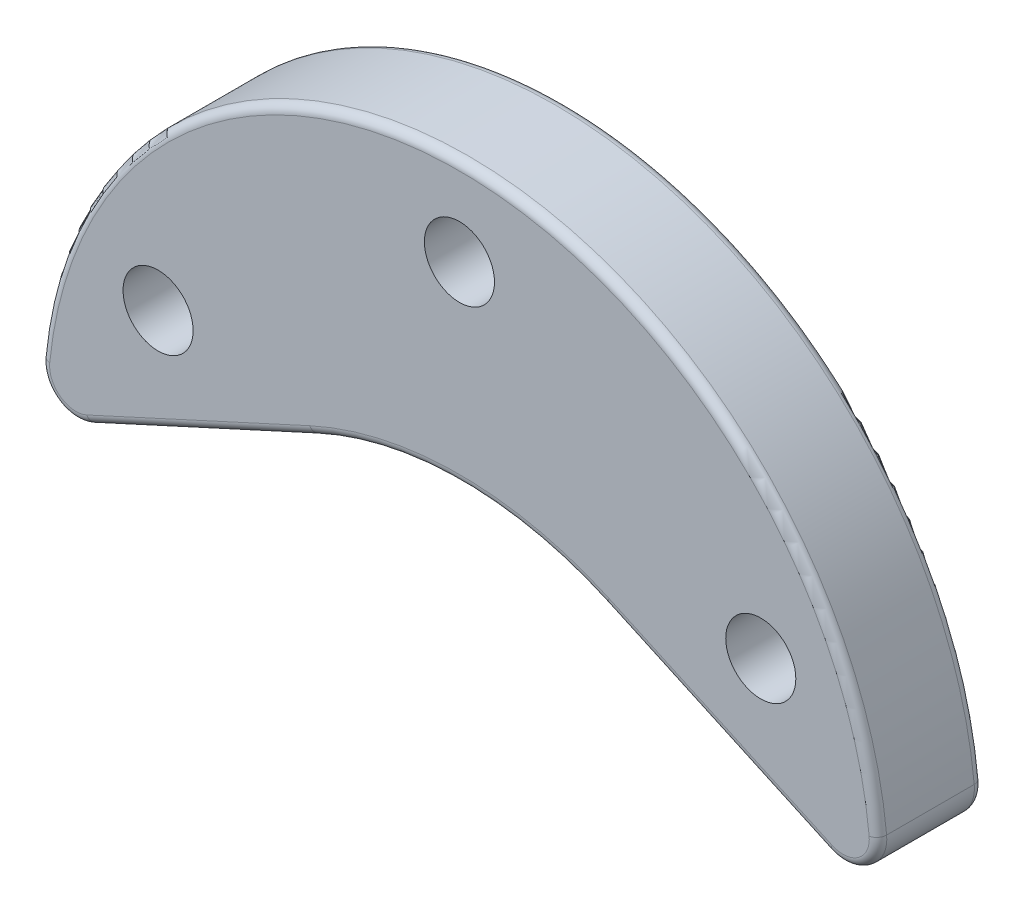
ISO-10303-21;
HEADER;
FILE_DESCRIPTION(('STEP AP214'),'2;1');
FILE_NAME('part.step','',(''),(''),'','','');
FILE_SCHEMA(('AUTOMOTIVE_DESIGN { 1 0 10303 214 1 1 1 1 }'));
ENDSEC;
DATA;
#1=APPLICATION_CONTEXT('core data for automotive mechanical design processes');
#2=APPLICATION_PROTOCOL_DEFINITION('international standard','automotive_design',2000,#1);
#3=PRODUCT_CONTEXT('',#1,'mechanical');
#4=PRODUCT('Part','Part','',(#3));
#5=PRODUCT_RELATED_PRODUCT_CATEGORY('part','',(#4));
#6=PRODUCT_DEFINITION_FORMATION('','',#4);
#7=PRODUCT_DEFINITION_CONTEXT('part definition',#1,'design');
#8=PRODUCT_DEFINITION('design','',#6,#7);
#9=PRODUCT_DEFINITION_SHAPE('','',#8);
#10=(LENGTH_UNIT() NAMED_UNIT(*) SI_UNIT(.MILLI.,.METRE.));
#11=(NAMED_UNIT(*) PLANE_ANGLE_UNIT() SI_UNIT($,.RADIAN.));
#12=(NAMED_UNIT(*) SI_UNIT($,.STERADIAN.) SOLID_ANGLE_UNIT());
#13=UNCERTAINTY_MEASURE_WITH_UNIT(LENGTH_MEASURE(1.E-05),#10,'distance_accuracy_value','');
#14=(GEOMETRIC_REPRESENTATION_CONTEXT(3) GLOBAL_UNCERTAINTY_ASSIGNED_CONTEXT((#13)) GLOBAL_UNIT_ASSIGNED_CONTEXT((#10,
#11,#12)) REPRESENTATION_CONTEXT('',''));
#15=CARTESIAN_POINT('',(0.,0.,0.));
#16=DIRECTION('',(0.,0.,1.));
#17=DIRECTION('',(1.,0.,0.));
#18=AXIS2_PLACEMENT_3D('',#15,#16,#17);
#19=CARTESIAN_POINT('',(0.,0.,-3.));
#20=DIRECTION('',(0.,0.,-1.));
#21=DIRECTION('',(-1.,0.,0.));
#22=AXIS2_PLACEMENT_3D('',#19,#20,#21);
#23=CYLINDRICAL_SURFACE('',#22,12.);
#24=DIRECTION('',(0.,0.,-1.));
#25=VECTOR('',#24,1.);
#26=CARTESIAN_POINT('',(11.9416242428372,1.18220575319335,-3.));
#27=LINE('',#26,#25);
#28=CARTESIAN_POINT('',(11.9416242428372,1.18220575319335,-3.25));
#29=VERTEX_POINT('',#28);
#30=CARTESIAN_POINT('',(11.9416242428372,1.18220575319335,-5.75));
#31=VERTEX_POINT('',#30);
#32=EDGE_CURVE('E245',#29,#31,#27,.T.);
#33=ORIENTED_EDGE('',*,*,#32,.T.);
#34=CARTESIAN_POINT('',(0.,0.,-5.75));
#35=DIRECTION('',(0.,0.,1.));
#36=DIRECTION('',(1.,0.,0.));
#37=AXIS2_PLACEMENT_3D('',#34,#35,#36);
#38=CIRCLE('',#37,12.);
#39=CARTESIAN_POINT('',(-11.9416242428372,1.18220575319335,-5.75));
#40=VERTEX_POINT('',#39);
#41=EDGE_CURVE('E11',#31,#40,#38,.T.);
#42=ORIENTED_EDGE('',*,*,#41,.T.);
#43=DIRECTION('',(0.,0.,-1.));
#44=VECTOR('',#43,1.);
#45=CARTESIAN_POINT('',(-11.9416242428372,1.18220575319335,-3.));
#46=LINE('',#45,#44);
#47=CARTESIAN_POINT('',(-11.9416242428372,1.18220575319335,-3.25));
#48=VERTEX_POINT('',#47);
#49=EDGE_CURVE('E248',#40,#48,#46,.F.);
#50=ORIENTED_EDGE('',*,*,#49,.T.);
#51=CARTESIAN_POINT('',(0.,0.,-3.25));
#52=DIRECTION('',(0.,0.,1.));
#53=DIRECTION('',(1.,0.,0.));
#54=AXIS2_PLACEMENT_3D('',#51,#52,#53);
#55=CIRCLE('',#54,12.);
#56=EDGE_CURVE('E43',#48,#29,#55,.F.);
#57=ORIENTED_EDGE('',*,*,#56,.T.);
#58=EDGE_LOOP('',(#33,#42,#50,#57));
#59=FACE_BOUND('',#58,.T.);
#60=ADVANCED_FACE('F34',(#59),#23,.T.);
#61=CARTESIAN_POINT('',(-4.16597790450531,3.09090909090909,-3.));
#62=DIRECTION('',(-0.416597790450531,0.909090909090909,0.));
#63=DIRECTION('',(-0.909090909090909,-0.416597790450531,0.));
#64=AXIS2_PLACEMENT_3D('',#61,#62,#63);
#65=PLANE('',#64);
#66=DIRECTION('',(0.,0.,-1.));
#67=VECTOR('',#66,1.);
#68=CARTESIAN_POINT('',(-4.16597790450531,3.09090909090909,-3.));
#69=LINE('',#68,#67);
#70=CARTESIAN_POINT('',(-4.16597790450531,3.09090909090909,-3.25));
#71=VERTEX_POINT('',#70);
#72=CARTESIAN_POINT('',(-4.16597790450531,3.09090909090909,-5.75));
#73=VERTEX_POINT('',#72);
#74=EDGE_CURVE('E237',#71,#73,#69,.T.);
#75=ORIENTED_EDGE('',*,*,#74,.F.);
#76=DIRECTION('',(0.909090909090909,0.416597790450531,0.));
#77=VECTOR('',#76,1.);
#78=CARTESIAN_POINT('',(-10.5298910988169,0.17459769800299,-3.25));
#79=LINE('',#78,#77);
#80=CARTESIAN_POINT('',(-10.5298910988169,0.174597698002991,-3.25));
#81=VERTEX_POINT('',#80);
#82=EDGE_CURVE('E186',#71,#81,#79,.F.);
#83=ORIENTED_EDGE('',*,*,#82,.T.);
#84=DIRECTION('',(0.,0.,-1.));
#85=VECTOR('',#84,1.);
#86=CARTESIAN_POINT('',(-10.5298910988169,0.174597698002991,-3.));
#87=LINE('',#86,#85);
#88=CARTESIAN_POINT('',(-10.5298910988169,0.174597698002991,-5.75));
#89=VERTEX_POINT('',#88);
#90=EDGE_CURVE('E239',#81,#89,#87,.T.);
#91=ORIENTED_EDGE('',*,*,#90,.T.);
#92=DIRECTION('',(0.909090909090909,0.416597790450531,0.));
#93=VECTOR('',#92,1.);
#94=CARTESIAN_POINT('',(-4.16597790450531,3.09090909090909,-5.75));
#95=LINE('',#94,#93);
#96=EDGE_CURVE('E51',#89,#73,#95,.T.);
#97=ORIENTED_EDGE('',*,*,#96,.T.);
#98=EDGE_LOOP('',(#75,#83,#91,#97));
#99=FACE_BOUND('',#98,.T.);
#100=ADVANCED_FACE('F284',(#99),#65,.F.);
#101=CARTESIAN_POINT('',(0.,-6.,-3.));
#102=DIRECTION('',(0.,0.,-1.));
#103=DIRECTION('',(-1.,0.,0.));
#104=AXIS2_PLACEMENT_3D('',#101,#102,#103);
#105=CYLINDRICAL_SURFACE('',#104,10.);
#106=DIRECTION('',(0.,0.,-1.));
#107=VECTOR('',#106,1.);
#108=CARTESIAN_POINT('',(4.16597790450531,3.09090909090909,-3.));
#109=LINE('',#108,#107);
#110=CARTESIAN_POINT('',(4.16597790450531,3.09090909090909,-3.25));
#111=VERTEX_POINT('',#110);
#112=CARTESIAN_POINT('',(4.16597790450531,3.09090909090909,-5.75));
#113=VERTEX_POINT('',#112);
#114=EDGE_CURVE('E203',#111,#113,#109,.T.);
#115=ORIENTED_EDGE('',*,*,#114,.F.);
#116=CARTESIAN_POINT('',(0.,-6.,-3.25));
#117=DIRECTION('',(0.,0.,1.));
#118=DIRECTION('',(1.,0.,0.));
#119=AXIS2_PLACEMENT_3D('',#116,#117,#118);
#120=CIRCLE('',#119,10.);
#121=EDGE_CURVE('E58',#111,#71,#120,.T.);
#122=ORIENTED_EDGE('',*,*,#121,.T.);
#123=ORIENTED_EDGE('',*,*,#74,.T.);
#124=CARTESIAN_POINT('',(0.,-6.,-5.75));
#125=DIRECTION('',(0.,0.,1.));
#126=DIRECTION('',(1.,0.,0.));
#127=AXIS2_PLACEMENT_3D('',#124,#125,#126);
#128=CIRCLE('',#127,10.);
#129=EDGE_CURVE('E188',#73,#113,#128,.F.);
#130=ORIENTED_EDGE('',*,*,#129,.T.);
#131=EDGE_LOOP('',(#115,#122,#123,#130));
#132=FACE_BOUND('',#131,.T.);
#133=ADVANCED_FACE('F235',(#132),#105,.F.);
#134=CARTESIAN_POINT('',(4.16597790450531,3.09090909090909,-3.));
#135=DIRECTION('',(0.416597790450531,0.909090909090909,0.));
#136=DIRECTION('',(-0.909090909090909,0.416597790450531,0.));
#137=AXIS2_PLACEMENT_3D('',#134,#135,#136);
#138=PLANE('',#137);
#139=DIRECTION('',(0.,0.,-1.));
#140=VECTOR('',#139,1.);
#141=CARTESIAN_POINT('',(10.5298910988169,0.174597698002993,-3.));
#142=LINE('',#141,#140);
#143=CARTESIAN_POINT('',(10.5298910988169,0.174597698002993,-5.75));
#144=VERTEX_POINT('',#143);
#145=CARTESIAN_POINT('',(10.5298910988169,0.174597698002993,-3.25));
#146=VERTEX_POINT('',#145);
#147=EDGE_CURVE('E146',#144,#146,#142,.F.);
#148=ORIENTED_EDGE('',*,*,#147,.T.);
#149=DIRECTION('',(0.909090909090909,-0.416597790450531,0.));
#150=VECTOR('',#149,1.);
#151=CARTESIAN_POINT('',(4.16597790450531,3.09090909090909,-3.25));
#152=LINE('',#151,#150);
#153=EDGE_CURVE('E183',#146,#111,#152,.F.);
#154=ORIENTED_EDGE('',*,*,#153,.T.);
#155=ORIENTED_EDGE('',*,*,#114,.T.);
#156=DIRECTION('',(0.909090909090909,-0.416597790450531,0.));
#157=VECTOR('',#156,1.);
#158=CARTESIAN_POINT('',(4.16597790450531,3.09090909090909,-5.75));
#159=LINE('',#158,#157);
#160=EDGE_CURVE('E181',#113,#144,#159,.T.);
#161=ORIENTED_EDGE('',*,*,#160,.T.);
#162=EDGE_LOOP('',(#148,#154,#155,#161));
#163=FACE_BOUND('',#162,.T.);
#164=ADVANCED_FACE('F232',(#163),#138,.F.);
#165=CARTESIAN_POINT('',(0.,0.,-3.));
#166=DIRECTION('',(0.,0.,1.));
#167=DIRECTION('',(1.,0.,0.));
#168=AXIS2_PLACEMENT_3D('',#165,#166,#167);
#169=PLANE('',#168);
#170=CARTESIAN_POINT('',(0.,9.5,-3.));
#171=DIRECTION('',(0.,0.,1.));
#172=DIRECTION('',(1.,0.,0.));
#173=AXIS2_PLACEMENT_3D('',#170,#171,#172);
#174=CIRCLE('',#173,1.);
#175=CARTESIAN_POINT('',(1.,9.5,-3.));
#176=VERTEX_POINT('',#175);
#177=EDGE_CURVE('E207',#176,#176,#174,.T.);
#178=ORIENTED_EDGE('',*,*,#177,.F.);
#179=EDGE_LOOP('',(#178));
#180=FACE_BOUND('',#179,.T.);
#181=CARTESIAN_POINT('',(-8.6,4.,-3.));
#182=DIRECTION('',(0.,0.,1.));
#183=DIRECTION('',(1.,0.,0.));
#184=AXIS2_PLACEMENT_3D('',#181,#182,#183);
#185=CIRCLE('',#184,1.);
#186=CARTESIAN_POINT('',(-7.6,4.,-3.));
#187=VERTEX_POINT('',#186);
#188=EDGE_CURVE('E460',#187,#187,#185,.T.);
#189=ORIENTED_EDGE('',*,*,#188,.F.);
#190=EDGE_LOOP('',(#189));
#191=FACE_BOUND('',#190,.T.);
#192=CARTESIAN_POINT('',(8.6,4.,-3.));
#193=DIRECTION('',(0.,0.,1.));
#194=DIRECTION('',(1.,0.,0.));
#195=AXIS2_PLACEMENT_3D('',#192,#193,#194);
#196=CIRCLE('',#195,1.);
#197=CARTESIAN_POINT('',(9.6,4.,-3.));
#198=VERTEX_POINT('',#197);
#199=EDGE_CURVE('E457',#198,#198,#196,.T.);
#200=ORIENTED_EDGE('',*,*,#199,.F.);
#201=EDGE_LOOP('',(#200));
#202=FACE_BOUND('',#201,.T.);
#203=DIRECTION('',(0.909090909090909,0.416597790450531,0.));
#204=VECTOR('',#203,1.);
#205=CARTESIAN_POINT('',(-4.27012735211794,3.31818181818182,-3.));
#206=LINE('',#205,#204);
#207=CARTESIAN_POINT('',(-10.6340405464295,0.401870425275719,-3.));
#208=VERTEX_POINT('',#207);
#209=CARTESIAN_POINT('',(-4.27012735211794,3.31818181818182,-3.));
#210=VERTEX_POINT('',#209);
#211=EDGE_CURVE('E171',#208,#210,#206,.T.);
#212=ORIENTED_EDGE('',*,*,#211,.T.);
#213=CARTESIAN_POINT('',(0.,-6.,-3.));
#214=DIRECTION('',(0.,0.,1.));
#215=DIRECTION('',(1.,0.,0.));
#216=AXIS2_PLACEMENT_3D('',#213,#214,#215);
#217=CIRCLE('',#216,10.25);
#218=CARTESIAN_POINT('',(4.27012735211794,3.31818181818182,-3.));
#219=VERTEX_POINT('',#218);
#220=EDGE_CURVE('E175',#210,#219,#217,.F.);
#221=ORIENTED_EDGE('',*,*,#220,.T.);
#222=DIRECTION('',(0.909090909090909,-0.416597790450531,0.));
#223=VECTOR('',#222,1.);
#224=CARTESIAN_POINT('',(10.6340405464295,0.401870425275719,-3.));
#225=LINE('',#224,#223);
#226=CARTESIAN_POINT('',(10.6340405464295,0.401870425275718,-3.));
#227=VERTEX_POINT('',#226);
#228=EDGE_CURVE('E173',#219,#227,#225,.T.);
#229=ORIENTED_EDGE('',*,*,#228,.T.);
#230=CARTESIAN_POINT('',(10.9464888892674,1.0836886070939,-3.));
#231=DIRECTION('',(0.,0.,1.));
#232=DIRECTION('',(1.,0.,0.));
#233=AXIS2_PLACEMENT_3D('',#230,#231,#232);
#234=CIRCLE('',#233,0.75);
#235=CARTESIAN_POINT('',(11.6928404044447,1.15757646666848,-3.));
#236=VERTEX_POINT('',#235);
#237=EDGE_CURVE('E166',#227,#236,#234,.T.);
#238=ORIENTED_EDGE('',*,*,#237,.T.);
#239=CARTESIAN_POINT('',(0.,0.,-3.));
#240=DIRECTION('',(0.,0.,1.));
#241=DIRECTION('',(1.,0.,0.));
#242=AXIS2_PLACEMENT_3D('',#239,#240,#241);
#243=CIRCLE('',#242,11.75);
#244=CARTESIAN_POINT('',(-11.6928404044447,1.15757646666849,-3.));
#245=VERTEX_POINT('',#244);
#246=EDGE_CURVE('E164',#236,#245,#243,.T.);
#247=ORIENTED_EDGE('',*,*,#246,.T.);
#248=CARTESIAN_POINT('',(-10.9464888892674,1.0836886070939,-3.));
#249=DIRECTION('',(0.,0.,1.));
#250=DIRECTION('',(1.,0.,0.));
#251=AXIS2_PLACEMENT_3D('',#248,#249,#250);
#252=CIRCLE('',#251,0.75);
#253=EDGE_CURVE('E168',#245,#208,#252,.T.);
#254=ORIENTED_EDGE('',*,*,#253,.T.);
#255=EDGE_LOOP('',(#212,#221,#229,#238,#247,#254));
#256=FACE_BOUND('',#255,.T.);
#257=ADVANCED_FACE('F270',(#180,#191,#202,#256),#169,.T.);
#258=CARTESIAN_POINT('',(0.,0.,-6.));
#259=DIRECTION('',(0.,0.,1.));
#260=DIRECTION('',(1.,0.,0.));
#261=AXIS2_PLACEMENT_3D('',#258,#259,#260);
#262=PLANE('',#261);
#263=CARTESIAN_POINT('',(0.,9.5,-6.));
#264=DIRECTION('',(0.,0.,-1.));
#265=DIRECTION('',(-1.,0.,0.));
#266=AXIS2_PLACEMENT_3D('',#263,#264,#265);
#267=CIRCLE('',#266,1.);
#268=CARTESIAN_POINT('',(-1.,9.5,-6.));
#269=VERTEX_POINT('',#268);
#270=EDGE_CURVE('E456',#269,#269,#267,.T.);
#271=ORIENTED_EDGE('',*,*,#270,.F.);
#272=EDGE_LOOP('',(#271));
#273=FACE_BOUND('',#272,.T.);
#274=CARTESIAN_POINT('',(-8.6,4.,-6.));
#275=DIRECTION('',(0.,0.,-1.));
#276=DIRECTION('',(-1.,0.,0.));
#277=AXIS2_PLACEMENT_3D('',#274,#275,#276);
#278=CIRCLE('',#277,1.);
#279=CARTESIAN_POINT('',(-9.6,4.,-6.));
#280=VERTEX_POINT('',#279);
#281=EDGE_CURVE('E458',#280,#280,#278,.T.);
#282=ORIENTED_EDGE('',*,*,#281,.F.);
#283=EDGE_LOOP('',(#282));
#284=FACE_BOUND('',#283,.T.);
#285=CARTESIAN_POINT('',(8.6,4.,-6.));
#286=DIRECTION('',(0.,0.,-1.));
#287=DIRECTION('',(-1.,0.,0.));
#288=AXIS2_PLACEMENT_3D('',#285,#286,#287);
#289=CIRCLE('',#288,1.);
#290=CARTESIAN_POINT('',(7.6,4.,-6.));
#291=VERTEX_POINT('',#290);
#292=EDGE_CURVE('E463',#291,#291,#289,.T.);
#293=ORIENTED_EDGE('',*,*,#292,.F.);
#294=EDGE_LOOP('',(#293));
#295=FACE_BOUND('',#294,.T.);
#296=DIRECTION('',(0.909090909090909,-0.416597790450531,0.));
#297=VECTOR('',#296,1.);
#298=CARTESIAN_POINT('',(1.99777576784232,4.35950413223141,-6.));
#299=LINE('',#298,#297);
#300=CARTESIAN_POINT('',(10.6340405464295,0.401870425275718,-6.));
#301=VERTEX_POINT('',#300);
#302=CARTESIAN_POINT('',(4.27012735211794,3.31818181818182,-6.));
#303=VERTEX_POINT('',#302);
#304=EDGE_CURVE('E153',#301,#303,#299,.F.);
#305=ORIENTED_EDGE('',*,*,#304,.T.);
#306=CARTESIAN_POINT('',(0.,-6.,-6.));
#307=DIRECTION('',(0.,0.,1.));
#308=DIRECTION('',(1.,0.,0.));
#309=AXIS2_PLACEMENT_3D('',#306,#307,#308);
#310=CIRCLE('',#309,10.25);
#311=CARTESIAN_POINT('',(-4.27012735211794,3.31818181818182,-6.));
#312=VERTEX_POINT('',#311);
#313=EDGE_CURVE('E158',#303,#312,#310,.T.);
#314=ORIENTED_EDGE('',*,*,#313,.T.);
#315=DIRECTION('',(0.909090909090909,0.416597790450531,0.));
#316=VECTOR('',#315,1.);
#317=CARTESIAN_POINT('',(-1.99777576784232,4.35950413223141,-6.));
#318=LINE('',#317,#316);
#319=CARTESIAN_POINT('',(-10.6340405464295,0.401870425275719,-6.));
#320=VERTEX_POINT('',#319);
#321=EDGE_CURVE('E150',#312,#320,#318,.F.);
#322=ORIENTED_EDGE('',*,*,#321,.T.);
#323=CARTESIAN_POINT('',(-10.9464888892674,1.0836886070939,-6.));
#324=DIRECTION('',(0.,0.,1.));
#325=DIRECTION('',(1.,0.,0.));
#326=AXIS2_PLACEMENT_3D('',#323,#324,#325);
#327=CIRCLE('',#326,0.75);
#328=CARTESIAN_POINT('',(-11.6928404044447,1.15757646666849,-6.));
#329=VERTEX_POINT('',#328);
#330=EDGE_CURVE('E131',#320,#329,#327,.F.);
#331=ORIENTED_EDGE('',*,*,#330,.T.);
#332=CARTESIAN_POINT('',(0.,0.,-6.));
#333=DIRECTION('',(0.,0.,1.));
#334=DIRECTION('',(1.,0.,0.));
#335=AXIS2_PLACEMENT_3D('',#332,#333,#334);
#336=CIRCLE('',#335,11.75);
#337=CARTESIAN_POINT('',(11.6928404044447,1.15757646666848,-6.));
#338=VERTEX_POINT('',#337);
#339=EDGE_CURVE('E139',#329,#338,#336,.F.);
#340=ORIENTED_EDGE('',*,*,#339,.T.);
#341=CARTESIAN_POINT('',(10.9464888892674,1.0836886070939,-6.));
#342=DIRECTION('',(0.,0.,1.));
#343=DIRECTION('',(1.,0.,0.));
#344=AXIS2_PLACEMENT_3D('',#341,#342,#343);
#345=CIRCLE('',#344,0.75);
#346=EDGE_CURVE('E145',#338,#301,#345,.F.);
#347=ORIENTED_EDGE('',*,*,#346,.T.);
#348=EDGE_LOOP('',(#305,#314,#322,#331,#340,#347));
#349=FACE_BOUND('',#348,.T.);
#350=ADVANCED_FACE('F148',(#273,#284,#295,#349),#262,.F.);
#351=CARTESIAN_POINT('',(-10.9464888892674,1.0836886070939,-3.));
#352=DIRECTION('',(0.,0.,-1.));
#353=DIRECTION('',(-1.,0.,0.));
#354=AXIS2_PLACEMENT_3D('',#351,#352,#353);
#355=CYLINDRICAL_SURFACE('',#354,1.);
#356=ORIENTED_EDGE('',*,*,#49,.F.);
#357=CARTESIAN_POINT('',(-10.9464888892674,1.0836886070939,-5.75));
#358=DIRECTION('',(0.,0.,1.));
#359=DIRECTION('',(1.,0.,0.));
#360=AXIS2_PLACEMENT_3D('',#357,#358,#359);
#361=CIRCLE('',#360,1.);
#362=EDGE_CURVE('E133',#40,#89,#361,.T.);
#363=ORIENTED_EDGE('',*,*,#362,.T.);
#364=ORIENTED_EDGE('',*,*,#90,.F.);
#365=CARTESIAN_POINT('',(-10.9464888892674,1.0836886070939,-3.25));
#366=DIRECTION('',(0.,0.,1.));
#367=DIRECTION('',(1.,0.,0.));
#368=AXIS2_PLACEMENT_3D('',#365,#366,#367);
#369=CIRCLE('',#368,1.);
#370=EDGE_CURVE('E160',#81,#48,#369,.F.);
#371=ORIENTED_EDGE('',*,*,#370,.T.);
#372=EDGE_LOOP('',(#356,#363,#364,#371));
#373=FACE_BOUND('',#372,.T.);
#374=ADVANCED_FACE('F256',(#373),#355,.T.);
#375=CARTESIAN_POINT('',(10.9464888892674,1.0836886070939,-3.));
#376=DIRECTION('',(0.,0.,-1.));
#377=DIRECTION('',(-1.,0.,0.));
#378=AXIS2_PLACEMENT_3D('',#375,#376,#377);
#379=CYLINDRICAL_SURFACE('',#378,1.);
#380=ORIENTED_EDGE('',*,*,#32,.F.);
#381=CARTESIAN_POINT('',(10.9464888892674,1.0836886070939,-3.25));
#382=DIRECTION('',(0.,0.,1.));
#383=DIRECTION('',(1.,0.,0.));
#384=AXIS2_PLACEMENT_3D('',#381,#382,#383);
#385=CIRCLE('',#384,1.);
#386=EDGE_CURVE('E179',#29,#146,#385,.F.);
#387=ORIENTED_EDGE('',*,*,#386,.T.);
#388=ORIENTED_EDGE('',*,*,#147,.F.);
#389=CARTESIAN_POINT('',(10.9464888892674,1.0836886070939,-5.75));
#390=DIRECTION('',(0.,0.,1.));
#391=DIRECTION('',(1.,0.,0.));
#392=AXIS2_PLACEMENT_3D('',#389,#390,#391);
#393=CIRCLE('',#392,1.);
#394=EDGE_CURVE('E177',#144,#31,#393,.T.);
#395=ORIENTED_EDGE('',*,*,#394,.T.);
#396=EDGE_LOOP('',(#380,#387,#388,#395));
#397=FACE_BOUND('',#396,.T.);
#398=ADVANCED_FACE('F294',(#397),#379,.T.);
#399=CARTESIAN_POINT('',(4.27012735211794,3.31818181818182,-5.75));
#400=DIRECTION('',(0.909090909090909,-0.416597790450531,0.));
#401=DIRECTION('',(0.416597790450531,0.909090909090909,0.));
#402=AXIS2_PLACEMENT_3D('',#399,#400,#401);
#403=CYLINDRICAL_SURFACE('',#402,0.25);
#404=CARTESIAN_POINT('',(10.6340405464295,0.40187042527572,-5.75));
#405=DIRECTION('',(0.90909090909091,-0.416597790450529,0.));
#406=DIRECTION('',(0.416597790450529,0.90909090909091,0.));
#407=AXIS2_PLACEMENT_3D('',#404,#405,#406);
#408=CIRCLE('',#407,0.25);
#409=EDGE_CURVE('E197',#144,#301,#408,.T.);
#410=ORIENTED_EDGE('',*,*,#409,.F.);
#411=ORIENTED_EDGE('',*,*,#160,.F.);
#412=CARTESIAN_POINT('',(4.27012735211794,3.31818181818182,-5.75));
#413=DIRECTION('',(-0.909090909090908,0.416597790450532,0.));
#414=DIRECTION('',(-0.416597790450532,-0.909090909090909,0.));
#415=AXIS2_PLACEMENT_3D('',#412,#413,#414);
#416=CIRCLE('',#415,0.25);
#417=EDGE_CURVE('E200',#303,#113,#416,.T.);
#418=ORIENTED_EDGE('',*,*,#417,.F.);
#419=ORIENTED_EDGE('',*,*,#304,.F.);
#420=EDGE_LOOP('',(#410,#411,#418,#419));
#421=FACE_BOUND('',#420,.T.);
#422=ADVANCED_FACE('F297',(#421),#403,.T.);
#423=CARTESIAN_POINT('',(0.,-6.,-5.75));
#424=DIRECTION('',(0.,0.,1.));
#425=DIRECTION('',(1.,0.,0.));
#426=AXIS2_PLACEMENT_3D('',#423,#424,#425);
#427=TOROIDAL_SURFACE('',#426,10.25,0.25);
#428=ORIENTED_EDGE('',*,*,#417,.T.);
#429=ORIENTED_EDGE('',*,*,#129,.F.);
#430=CARTESIAN_POINT('',(-4.27012735211794,3.31818181818182,-5.75));
#431=DIRECTION('',(-0.909090909090909,-0.416597790450532,0.));
#432=DIRECTION('',(0.416597790450532,-0.909090909090909,0.));
#433=AXIS2_PLACEMENT_3D('',#430,#431,#432);
#434=CIRCLE('',#433,0.25);
#435=EDGE_CURVE('E194',#312,#73,#434,.T.);
#436=ORIENTED_EDGE('',*,*,#435,.F.);
#437=ORIENTED_EDGE('',*,*,#313,.F.);
#438=EDGE_LOOP('',(#428,#429,#436,#437));
#439=FACE_BOUND('',#438,.T.);
#440=ADVANCED_FACE('F310',(#439),#427,.T.);
#441=CARTESIAN_POINT('',(10.9464888892674,1.0836886070939,-5.75));
#442=DIRECTION('',(0.,0.,1.));
#443=DIRECTION('',(1.,0.,0.));
#444=AXIS2_PLACEMENT_3D('',#441,#442,#443);
#445=TOROIDAL_SURFACE('',#444,0.75,0.25);
#446=ORIENTED_EDGE('',*,*,#409,.T.);
#447=ORIENTED_EDGE('',*,*,#346,.F.);
#448=CARTESIAN_POINT('',(11.6928404044447,1.15757646666848,-5.75));
#449=DIRECTION('',(-0.0985171460994452,0.995135353569765,0.));
#450=DIRECTION('',(-0.995135353569765,-0.0985171460994453,0.));
#451=AXIS2_PLACEMENT_3D('',#448,#449,#450);
#452=CIRCLE('',#451,0.25);
#453=EDGE_CURVE('E142',#31,#338,#452,.T.);
#454=ORIENTED_EDGE('',*,*,#453,.F.);
#455=ORIENTED_EDGE('',*,*,#394,.F.);
#456=EDGE_LOOP('',(#446,#447,#454,#455));
#457=FACE_BOUND('',#456,.T.);
#458=ADVANCED_FACE('F306',(#457),#445,.T.);
#459=CARTESIAN_POINT('',(-4.27012735211794,3.31818181818182,-5.75));
#460=DIRECTION('',(0.909090909090909,0.416597790450531,0.));
#461=DIRECTION('',(-0.416597790450531,0.909090909090909,0.));
#462=AXIS2_PLACEMENT_3D('',#459,#460,#461);
#463=CYLINDRICAL_SURFACE('',#462,0.25);
#464=ORIENTED_EDGE('',*,*,#435,.T.);
#465=ORIENTED_EDGE('',*,*,#96,.F.);
#466=CARTESIAN_POINT('',(-10.6340405464295,0.401870425275719,-5.75));
#467=DIRECTION('',(-0.90909090909091,-0.416597790450528,0.));
#468=DIRECTION('',(0.416597790450529,-0.90909090909091,0.));
#469=AXIS2_PLACEMENT_3D('',#466,#467,#468);
#470=CIRCLE('',#469,0.25);
#471=EDGE_CURVE('E136',#320,#89,#470,.T.);
#472=ORIENTED_EDGE('',*,*,#471,.F.);
#473=ORIENTED_EDGE('',*,*,#321,.F.);
#474=EDGE_LOOP('',(#464,#465,#472,#473));
#475=FACE_BOUND('',#474,.T.);
#476=ADVANCED_FACE('F303',(#475),#463,.T.);
#477=CARTESIAN_POINT('',(0.,0.,-5.75));
#478=DIRECTION('',(0.,0.,1.));
#479=DIRECTION('',(1.,0.,0.));
#480=AXIS2_PLACEMENT_3D('',#477,#478,#479);
#481=TOROIDAL_SURFACE('',#480,11.75,0.25);
#482=ORIENTED_EDGE('',*,*,#453,.T.);
#483=ORIENTED_EDGE('',*,*,#339,.F.);
#484=CARTESIAN_POINT('',(-11.6928404044447,1.15757646666849,-5.75));
#485=DIRECTION('',(-0.0985171460994452,-0.995135353569765,0.));
#486=DIRECTION('',(0.995135353569765,-0.0985171460994453,0.));
#487=AXIS2_PLACEMENT_3D('',#484,#485,#486);
#488=CIRCLE('',#487,0.25);
#489=EDGE_CURVE('E127',#40,#329,#488,.T.);
#490=ORIENTED_EDGE('',*,*,#489,.F.);
#491=ORIENTED_EDGE('',*,*,#41,.F.);
#492=EDGE_LOOP('',(#482,#483,#490,#491));
#493=FACE_BOUND('',#492,.T.);
#494=ADVANCED_FACE('F140',(#493),#481,.T.);
#495=CARTESIAN_POINT('',(-10.9464888892674,1.0836886070939,-5.75));
#496=DIRECTION('',(0.,0.,1.));
#497=DIRECTION('',(1.,0.,0.));
#498=AXIS2_PLACEMENT_3D('',#495,#496,#497);
#499=TOROIDAL_SURFACE('',#498,0.75,0.25);
#500=ORIENTED_EDGE('',*,*,#471,.T.);
#501=ORIENTED_EDGE('',*,*,#362,.F.);
#502=ORIENTED_EDGE('',*,*,#489,.T.);
#503=ORIENTED_EDGE('',*,*,#330,.F.);
#504=EDGE_LOOP('',(#500,#501,#502,#503));
#505=FACE_BOUND('',#504,.T.);
#506=ADVANCED_FACE('F129',(#505),#499,.T.);
#507=CARTESIAN_POINT('',(1.99777576784232,4.35950413223141,-3.25));
#508=DIRECTION('',(-0.909090909090909,0.416597790450531,0.));
#509=DIRECTION('',(-0.416597790450531,-0.909090909090909,0.));
#510=AXIS2_PLACEMENT_3D('',#507,#508,#509);
#511=CYLINDRICAL_SURFACE('',#510,0.25);
#512=CARTESIAN_POINT('',(4.27012735211794,3.31818181818182,-3.25));
#513=DIRECTION('',(-0.909090909090908,0.416597790450532,0.));
#514=DIRECTION('',(-0.416597790450532,-0.909090909090909,0.));
#515=AXIS2_PLACEMENT_3D('',#512,#513,#514);
#516=CIRCLE('',#515,0.25);
#517=EDGE_CURVE('E214',#111,#219,#516,.T.);
#518=ORIENTED_EDGE('',*,*,#517,.F.);
#519=ORIENTED_EDGE('',*,*,#153,.F.);
#520=CARTESIAN_POINT('',(10.6340405464295,0.40187042527572,-3.25));
#521=DIRECTION('',(0.90909090909091,-0.416597790450529,0.));
#522=DIRECTION('',(0.416597790450529,0.90909090909091,0.));
#523=AXIS2_PLACEMENT_3D('',#520,#521,#522);
#524=CIRCLE('',#523,0.25);
#525=EDGE_CURVE('E38',#227,#146,#524,.T.);
#526=ORIENTED_EDGE('',*,*,#525,.F.);
#527=ORIENTED_EDGE('',*,*,#228,.F.);
#528=EDGE_LOOP('',(#518,#519,#526,#527));
#529=FACE_BOUND('',#528,.T.);
#530=ADVANCED_FACE('F36',(#529),#511,.T.);
#531=CARTESIAN_POINT('',(10.9464888892674,1.0836886070939,-3.25));
#532=DIRECTION('',(0.,0.,1.));
#533=DIRECTION('',(1.,0.,0.));
#534=AXIS2_PLACEMENT_3D('',#531,#532,#533);
#535=TOROIDAL_SURFACE('',#534,0.75,0.25);
#536=ORIENTED_EDGE('',*,*,#525,.T.);
#537=ORIENTED_EDGE('',*,*,#386,.F.);
#538=CARTESIAN_POINT('',(11.6928404044447,1.15757646666848,-3.25));
#539=DIRECTION('',(-0.0985171460994452,0.995135353569765,0.));
#540=DIRECTION('',(-0.995135353569765,-0.0985171460994453,0.));
#541=AXIS2_PLACEMENT_3D('',#538,#539,#540);
#542=CIRCLE('',#541,0.25);
#543=EDGE_CURVE('E212',#236,#29,#542,.T.);
#544=ORIENTED_EDGE('',*,*,#543,.F.);
#545=ORIENTED_EDGE('',*,*,#237,.F.);
#546=EDGE_LOOP('',(#536,#537,#544,#545));
#547=FACE_BOUND('',#546,.T.);
#548=ADVANCED_FACE('F224',(#547),#535,.T.);
#549=CARTESIAN_POINT('',(0.,-6.,-3.25));
#550=DIRECTION('',(0.,0.,1.));
#551=DIRECTION('',(1.,0.,0.));
#552=AXIS2_PLACEMENT_3D('',#549,#550,#551);
#553=TOROIDAL_SURFACE('',#552,10.25,0.25);
#554=ORIENTED_EDGE('',*,*,#517,.T.);
#555=ORIENTED_EDGE('',*,*,#220,.F.);
#556=CARTESIAN_POINT('',(-4.27012735211794,3.31818181818182,-3.25));
#557=DIRECTION('',(-0.90909090909091,-0.416597790450529,0.));
#558=DIRECTION('',(0.416597790450529,-0.90909090909091,0.));
#559=AXIS2_PLACEMENT_3D('',#556,#557,#558);
#560=CIRCLE('',#559,0.25);
#561=EDGE_CURVE('E209',#71,#210,#560,.T.);
#562=ORIENTED_EDGE('',*,*,#561,.F.);
#563=ORIENTED_EDGE('',*,*,#121,.F.);
#564=EDGE_LOOP('',(#554,#555,#562,#563));
#565=FACE_BOUND('',#564,.T.);
#566=ADVANCED_FACE('F275',(#565),#553,.T.);
#567=CARTESIAN_POINT('',(0.,0.,-3.25));
#568=DIRECTION('',(0.,0.,1.));
#569=DIRECTION('',(1.,0.,0.));
#570=AXIS2_PLACEMENT_3D('',#567,#568,#569);
#571=TOROIDAL_SURFACE('',#570,11.75,0.25);
#572=ORIENTED_EDGE('',*,*,#543,.T.);
#573=ORIENTED_EDGE('',*,*,#56,.F.);
#574=CARTESIAN_POINT('',(-11.6928404044447,1.15757646666849,-3.25));
#575=DIRECTION('',(-0.0985171460994452,-0.995135353569765,0.));
#576=DIRECTION('',(0.995135353569765,-0.0985171460994453,0.));
#577=AXIS2_PLACEMENT_3D('',#574,#575,#576);
#578=CIRCLE('',#577,0.25);
#579=EDGE_CURVE('E206',#245,#48,#578,.T.);
#580=ORIENTED_EDGE('',*,*,#579,.F.);
#581=ORIENTED_EDGE('',*,*,#246,.F.);
#582=EDGE_LOOP('',(#572,#573,#580,#581));
#583=FACE_BOUND('',#582,.T.);
#584=ADVANCED_FACE('F273',(#583),#571,.T.);
#585=CARTESIAN_POINT('',(-1.99777576784232,4.35950413223141,-3.25));
#586=DIRECTION('',(-0.909090909090909,-0.416597790450531,0.));
#587=DIRECTION('',(0.416597790450531,-0.909090909090909,0.));
#588=AXIS2_PLACEMENT_3D('',#585,#586,#587);
#589=CYLINDRICAL_SURFACE('',#588,0.25);
#590=ORIENTED_EDGE('',*,*,#561,.T.);
#591=ORIENTED_EDGE('',*,*,#211,.F.);
#592=CARTESIAN_POINT('',(-10.6340405464295,0.401870425275718,-3.25));
#593=DIRECTION('',(-0.90909090909091,-0.416597790450529,0.));
#594=DIRECTION('',(0.416597790450529,-0.90909090909091,0.));
#595=AXIS2_PLACEMENT_3D('',#592,#593,#594);
#596=CIRCLE('',#595,0.25);
#597=EDGE_CURVE('E204',#81,#208,#596,.T.);
#598=ORIENTED_EDGE('',*,*,#597,.F.);
#599=ORIENTED_EDGE('',*,*,#82,.F.);
#600=EDGE_LOOP('',(#590,#591,#598,#599));
#601=FACE_BOUND('',#600,.T.);
#602=ADVANCED_FACE('F267',(#601),#589,.T.);
#603=CARTESIAN_POINT('',(-10.9464888892674,1.0836886070939,-3.25));
#604=DIRECTION('',(0.,0.,1.));
#605=DIRECTION('',(1.,0.,0.));
#606=AXIS2_PLACEMENT_3D('',#603,#604,#605);
#607=TOROIDAL_SURFACE('',#606,0.75,0.25);
#608=ORIENTED_EDGE('',*,*,#579,.T.);
#609=ORIENTED_EDGE('',*,*,#370,.F.);
#610=ORIENTED_EDGE('',*,*,#597,.T.);
#611=ORIENTED_EDGE('',*,*,#253,.F.);
#612=EDGE_LOOP('',(#608,#609,#610,#611));
#613=FACE_BOUND('',#612,.T.);
#614=ADVANCED_FACE('F261',(#613),#607,.T.);
#615=CARTESIAN_POINT('',(8.6,4.,4.));
#616=DIRECTION('',(0.,0.,-1.));
#617=DIRECTION('',(-1.,0.,0.));
#618=AXIS2_PLACEMENT_3D('',#615,#616,#617);
#619=CYLINDRICAL_SURFACE('',#618,1.);
#620=ORIENTED_EDGE('',*,*,#199,.T.);
#621=EDGE_LOOP('',(#620));
#622=FACE_BOUND('',#621,.T.);
#623=ORIENTED_EDGE('',*,*,#292,.T.);
#624=EDGE_LOOP('',(#623));
#625=FACE_BOUND('',#624,.T.);
#626=ADVANCED_FACE('F319',(#622,#625),#619,.F.);
#627=CARTESIAN_POINT('',(-8.6,4.,4.));
#628=DIRECTION('',(0.,0.,-1.));
#629=DIRECTION('',(-1.,0.,0.));
#630=AXIS2_PLACEMENT_3D('',#627,#628,#629);
#631=CYLINDRICAL_SURFACE('',#630,1.);
#632=ORIENTED_EDGE('',*,*,#188,.T.);
#633=EDGE_LOOP('',(#632));
#634=FACE_BOUND('',#633,.T.);
#635=ORIENTED_EDGE('',*,*,#281,.T.);
#636=EDGE_LOOP('',(#635));
#637=FACE_BOUND('',#636,.T.);
#638=ADVANCED_FACE('F323',(#634,#637),#631,.F.);
#639=CARTESIAN_POINT('',(0.,9.5,4.));
#640=DIRECTION('',(0.,0.,-1.));
#641=DIRECTION('',(-1.,0.,0.));
#642=AXIS2_PLACEMENT_3D('',#639,#640,#641);
#643=CYLINDRICAL_SURFACE('',#642,1.);
#644=ORIENTED_EDGE('',*,*,#177,.T.);
#645=EDGE_LOOP('',(#644));
#646=FACE_BOUND('',#645,.T.);
#647=ORIENTED_EDGE('',*,*,#270,.T.);
#648=EDGE_LOOP('',(#647));
#649=FACE_BOUND('',#648,.T.);
#650=ADVANCED_FACE('F329',(#646,#649),#643,.F.);
#651=CLOSED_SHELL('',(#60,#100,#133,#164,#257,#350,#374,#398,#422,#440,#458,#476,#494,#506,#530,
#548,#566,#584,#602,#614,#626,#638,#650));
#652=MANIFOLD_SOLID_BREP('B2',#651);
#653=ADVANCED_BREP_SHAPE_REPRESENTATION('',(#18,#652),#14);
#654=SHAPE_DEFINITION_REPRESENTATION(#9,#653);
ENDSEC;
END-ISO-10303-21;
